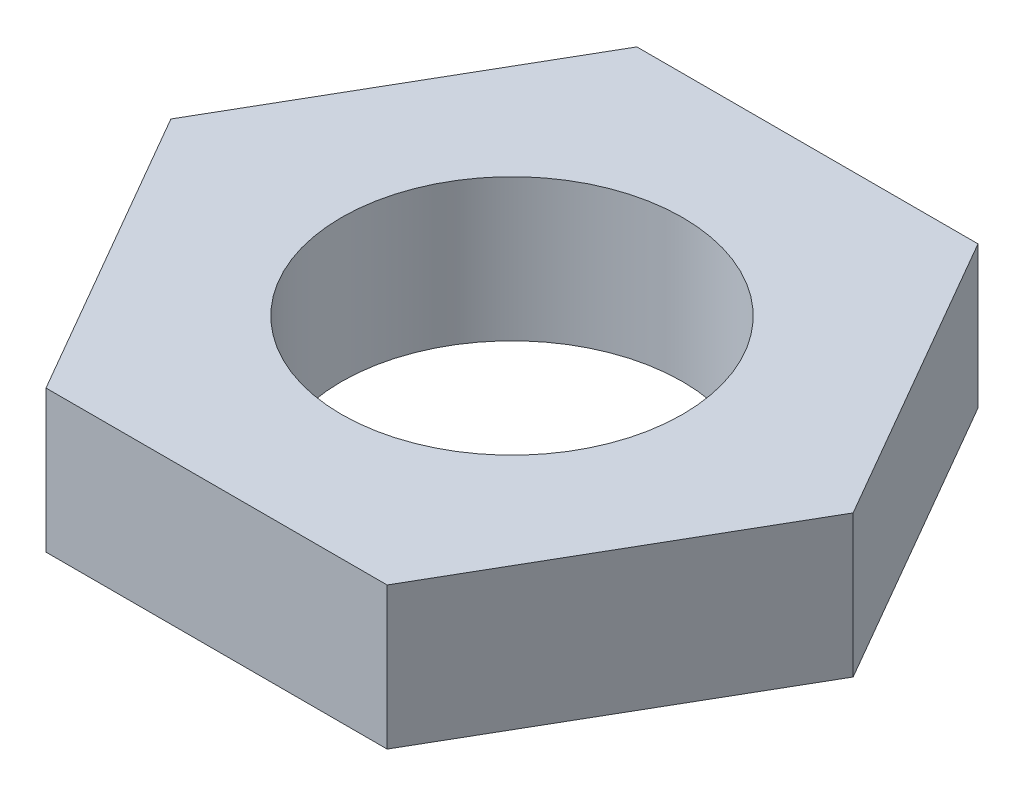
ISO-10303-21;
HEADER;
FILE_DESCRIPTION(('STEP AP214'),'2;1');
FILE_NAME('part.step','',(''),(''),'','','');
FILE_SCHEMA(('AUTOMOTIVE_DESIGN { 1 0 10303 214 1 1 1 1 }'));
ENDSEC;
DATA;
#1=APPLICATION_CONTEXT('core data for automotive mechanical design processes');
#2=APPLICATION_PROTOCOL_DEFINITION('international standard','automotive_design',2000,#1);
#3=PRODUCT_CONTEXT('',#1,'mechanical');
#4=PRODUCT('Part','Part','',(#3));
#5=PRODUCT_RELATED_PRODUCT_CATEGORY('part','',(#4));
#6=PRODUCT_DEFINITION_FORMATION('','',#4);
#7=PRODUCT_DEFINITION_CONTEXT('part definition',#1,'design');
#8=PRODUCT_DEFINITION('design','',#6,#7);
#9=PRODUCT_DEFINITION_SHAPE('','',#8);
#10=(LENGTH_UNIT() NAMED_UNIT(*) SI_UNIT(.MILLI.,.METRE.));
#11=(NAMED_UNIT(*) PLANE_ANGLE_UNIT() SI_UNIT($,.RADIAN.));
#12=(NAMED_UNIT(*) SI_UNIT($,.STERADIAN.) SOLID_ANGLE_UNIT());
#13=UNCERTAINTY_MEASURE_WITH_UNIT(LENGTH_MEASURE(1.E-05),#10,'distance_accuracy_value','');
#14=(GEOMETRIC_REPRESENTATION_CONTEXT(3) GLOBAL_UNCERTAINTY_ASSIGNED_CONTEXT((#13)) GLOBAL_UNIT_ASSIGNED_CONTEXT((#10,
#11,#12)) REPRESENTATION_CONTEXT('',''));
#15=CARTESIAN_POINT('',(0.,0.,0.));
#16=DIRECTION('',(0.,0.,1.));
#17=DIRECTION('',(1.,0.,0.));
#18=AXIS2_PLACEMENT_3D('',#15,#16,#17);
#19=CARTESIAN_POINT('',(0.,10.,0.));
#20=DIRECTION('',(0.,1.,0.));
#21=DIRECTION('',(0.,0.,1.));
#22=AXIS2_PLACEMENT_3D('',#19,#20,#21);
#23=PLANE('',#22);
#24=DIRECTION('',(1.,0.,0.));
#25=VECTOR('',#24,1.);
#26=CARTESIAN_POINT('',(-11.9999999999999,10.,20.784609690826));
#27=LINE('',#26,#25);
#28=CARTESIAN_POINT('',(-11.9999999999999,10.,20.784609690826));
#29=VERTEX_POINT('',#28);
#30=CARTESIAN_POINT('',(11.9999999999996,10.,20.7846096908262));
#31=VERTEX_POINT('',#30);
#32=EDGE_CURVE('E152',#29,#31,#27,.T.);
#33=ORIENTED_EDGE('',*,*,#32,.T.);
#34=DIRECTION('',(0.500000000000008,0.,-0.866025403784434));
#35=VECTOR('',#34,1.);
#36=CARTESIAN_POINT('',(11.9999999999996,10.,20.7846096908262));
#37=LINE('',#36,#35);
#38=CARTESIAN_POINT('',(23.9999999999995,10.,2.0643209364124E-13));
#39=VERTEX_POINT('',#38);
#40=EDGE_CURVE('E100',#31,#39,#37,.T.);
#41=ORIENTED_EDGE('',*,*,#40,.T.);
#42=DIRECTION('',(-0.499999999999993,0.,-0.866025403784443));
#43=VECTOR('',#42,1.);
#44=CARTESIAN_POINT('',(23.9999999999995,10.,2.0643209364124E-13));
#45=LINE('',#44,#43);
#46=CARTESIAN_POINT('',(11.9999999999999,10.,-20.784609690826));
#47=VERTEX_POINT('',#46);
#48=EDGE_CURVE('E113',#39,#47,#45,.T.);
#49=ORIENTED_EDGE('',*,*,#48,.T.);
#50=DIRECTION('',(-1.,0.,0.));
#51=VECTOR('',#50,1.);
#52=CARTESIAN_POINT('',(11.9999999999999,10.,-20.784609690826));
#53=LINE('',#52,#51);
#54=CARTESIAN_POINT('',(-11.9999999999996,10.,-20.7846096908262));
#55=VERTEX_POINT('',#54);
#56=EDGE_CURVE('E107',#47,#55,#53,.T.);
#57=ORIENTED_EDGE('',*,*,#56,.T.);
#58=DIRECTION('',(-0.500000000000007,0.,0.866025403784434));
#59=VECTOR('',#58,1.);
#60=CARTESIAN_POINT('',(-11.9999999999996,10.,-20.7846096908262));
#61=LINE('',#60,#59);
#62=CARTESIAN_POINT('',(-23.9999999999995,10.,-2.15105711021124E-13));
#63=VERTEX_POINT('',#62);
#64=EDGE_CURVE('E111',#55,#63,#61,.T.);
#65=ORIENTED_EDGE('',*,*,#64,.T.);
#66=DIRECTION('',(0.499999999999992,0.,0.866025403784443));
#67=VECTOR('',#66,1.);
#68=CARTESIAN_POINT('',(-23.9999999999995,10.,-2.15105711021124E-13));
#69=LINE('',#68,#67);
#70=EDGE_CURVE('E63',#63,#29,#69,.T.);
#71=ORIENTED_EDGE('',*,*,#70,.T.);
#72=EDGE_LOOP('',(#33,#41,#49,#57,#65,#71));
#73=FACE_BOUND('',#72,.T.);
#74=CARTESIAN_POINT('',(0.,10.,0.));
#75=DIRECTION('',(0.,1.,0.));
#76=DIRECTION('',(0.,0.,1.));
#77=AXIS2_PLACEMENT_3D('',#74,#75,#76);
#78=CIRCLE('',#77,12.);
#79=CARTESIAN_POINT('',(0.,10.,12.));
#80=VERTEX_POINT('',#79);
#81=EDGE_CURVE('E140',#80,#80,#78,.T.);
#82=ORIENTED_EDGE('',*,*,#81,.F.);
#83=EDGE_LOOP('',(#82));
#84=FACE_BOUND('',#83,.T.);
#85=ADVANCED_FACE('F45',(#73,#84),#23,.T.);
#86=CARTESIAN_POINT('',(0.,0.,0.));
#87=DIRECTION('',(0.,1.,0.));
#88=DIRECTION('',(0.,0.,1.));
#89=AXIS2_PLACEMENT_3D('',#86,#87,#88);
#90=PLANE('',#89);
#91=DIRECTION('',(1.,0.,0.));
#92=VECTOR('',#91,1.);
#93=CARTESIAN_POINT('',(-11.9999999999999,0.,20.784609690826));
#94=LINE('',#93,#92);
#95=CARTESIAN_POINT('',(-11.9999999999999,0.,20.784609690826));
#96=VERTEX_POINT('',#95);
#97=CARTESIAN_POINT('',(11.9999999999996,0.,20.7846096908262));
#98=VERTEX_POINT('',#97);
#99=EDGE_CURVE('E135',#96,#98,#94,.T.);
#100=ORIENTED_EDGE('',*,*,#99,.F.);
#101=DIRECTION('',(0.499999999999992,0.,0.866025403784443));
#102=VECTOR('',#101,1.);
#103=CARTESIAN_POINT('',(-23.9999999999995,0.,-2.15105711021124E-13));
#104=LINE('',#103,#102);
#105=CARTESIAN_POINT('',(-23.9999999999995,0.,-2.15105711021124E-13));
#106=VERTEX_POINT('',#105);
#107=EDGE_CURVE('E92',#106,#96,#104,.T.);
#108=ORIENTED_EDGE('',*,*,#107,.F.);
#109=DIRECTION('',(-0.500000000000007,0.,0.866025403784434));
#110=VECTOR('',#109,1.);
#111=CARTESIAN_POINT('',(-11.9999999999996,0.,-20.7846096908262));
#112=LINE('',#111,#110);
#113=CARTESIAN_POINT('',(-11.9999999999996,0.,-20.7846096908262));
#114=VERTEX_POINT('',#113);
#115=EDGE_CURVE('E86',#114,#106,#112,.T.);
#116=ORIENTED_EDGE('',*,*,#115,.F.);
#117=DIRECTION('',(-1.,0.,0.));
#118=VECTOR('',#117,1.);
#119=CARTESIAN_POINT('',(11.9999999999999,0.,-20.784609690826));
#120=LINE('',#119,#118);
#121=CARTESIAN_POINT('',(11.9999999999999,0.,-20.784609690826));
#122=VERTEX_POINT('',#121);
#123=EDGE_CURVE('E122',#122,#114,#120,.T.);
#124=ORIENTED_EDGE('',*,*,#123,.F.);
#125=DIRECTION('',(-0.499999999999993,0.,-0.866025403784443));
#126=VECTOR('',#125,1.);
#127=CARTESIAN_POINT('',(23.9999999999995,0.,2.0643209364124E-13));
#128=LINE('',#127,#126);
#129=CARTESIAN_POINT('',(23.9999999999995,0.,2.0643209364124E-13));
#130=VERTEX_POINT('',#129);
#131=EDGE_CURVE('E143',#130,#122,#128,.T.);
#132=ORIENTED_EDGE('',*,*,#131,.F.);
#133=DIRECTION('',(0.500000000000008,0.,-0.866025403784434));
#134=VECTOR('',#133,1.);
#135=CARTESIAN_POINT('',(11.9999999999996,0.,20.7846096908262));
#136=LINE('',#135,#134);
#137=EDGE_CURVE('E139',#98,#130,#136,.T.);
#138=ORIENTED_EDGE('',*,*,#137,.F.);
#139=EDGE_LOOP('',(#100,#108,#116,#124,#132,#138));
#140=FACE_BOUND('',#139,.T.);
#141=CARTESIAN_POINT('',(0.,0.,0.));
#142=DIRECTION('',(0.,1.,0.));
#143=DIRECTION('',(0.,0.,1.));
#144=AXIS2_PLACEMENT_3D('',#141,#142,#143);
#145=CIRCLE('',#144,12.);
#146=CARTESIAN_POINT('',(0.,0.,12.));
#147=VERTEX_POINT('',#146);
#148=EDGE_CURVE('E249',#147,#147,#145,.T.);
#149=ORIENTED_EDGE('',*,*,#148,.T.);
#150=EDGE_LOOP('',(#149));
#151=FACE_BOUND('',#150,.T.);
#152=ADVANCED_FACE('F165',(#140,#151),#90,.F.);
#153=CARTESIAN_POINT('',(-11.9999999999999,10.,20.784609690826));
#154=DIRECTION('',(0.,0.,-1.));
#155=DIRECTION('',(-1.,0.,0.));
#156=AXIS2_PLACEMENT_3D('',#153,#154,#155);
#157=PLANE('',#156);
#158=ORIENTED_EDGE('',*,*,#99,.T.);
#159=DIRECTION('',(0.,-1.,0.));
#160=VECTOR('',#159,1.);
#161=CARTESIAN_POINT('',(11.9999999999996,10.,20.7846096908262));
#162=LINE('',#161,#160);
#163=EDGE_CURVE('E11',#31,#98,#162,.T.);
#164=ORIENTED_EDGE('',*,*,#163,.F.);
#165=ORIENTED_EDGE('',*,*,#32,.F.);
#166=DIRECTION('',(0.,-1.,0.));
#167=VECTOR('',#166,1.);
#168=CARTESIAN_POINT('',(-11.9999999999999,10.,20.784609690826));
#169=LINE('',#168,#167);
#170=EDGE_CURVE('E131',#29,#96,#169,.T.);
#171=ORIENTED_EDGE('',*,*,#170,.T.);
#172=EDGE_LOOP('',(#158,#164,#165,#171));
#173=FACE_BOUND('',#172,.T.);
#174=ADVANCED_FACE('F47',(#173),#157,.F.);
#175=CARTESIAN_POINT('',(11.9999999999996,10.,20.7846096908262));
#176=DIRECTION('',(-0.866025403784434,0.,-0.500000000000008));
#177=DIRECTION('',(-0.500000000000008,0.,0.866025403784434));
#178=AXIS2_PLACEMENT_3D('',#175,#176,#177);
#179=PLANE('',#178);
#180=ORIENTED_EDGE('',*,*,#137,.T.);
#181=DIRECTION('',(0.,-1.,0.));
#182=VECTOR('',#181,1.);
#183=CARTESIAN_POINT('',(23.9999999999995,10.,2.0643209364124E-13));
#184=LINE('',#183,#182);
#185=EDGE_CURVE('E55',#39,#130,#184,.T.);
#186=ORIENTED_EDGE('',*,*,#185,.F.);
#187=ORIENTED_EDGE('',*,*,#40,.F.);
#188=ORIENTED_EDGE('',*,*,#163,.T.);
#189=EDGE_LOOP('',(#180,#186,#187,#188));
#190=FACE_BOUND('',#189,.T.);
#191=ADVANCED_FACE('F190',(#190),#179,.F.);
#192=CARTESIAN_POINT('',(23.9999999999995,10.,2.0643209364124E-13));
#193=DIRECTION('',(-0.866025403784443,0.,0.499999999999993));
#194=DIRECTION('',(0.499999999999993,0.,0.866025403784443));
#195=AXIS2_PLACEMENT_3D('',#192,#193,#194);
#196=PLANE('',#195);
#197=ORIENTED_EDGE('',*,*,#131,.T.);
#198=DIRECTION('',(0.,-1.,0.));
#199=VECTOR('',#198,1.);
#200=CARTESIAN_POINT('',(11.9999999999999,10.,-20.784609690826));
#201=LINE('',#200,#199);
#202=EDGE_CURVE('E124',#47,#122,#201,.T.);
#203=ORIENTED_EDGE('',*,*,#202,.F.);
#204=ORIENTED_EDGE('',*,*,#48,.F.);
#205=ORIENTED_EDGE('',*,*,#185,.T.);
#206=EDGE_LOOP('',(#197,#203,#204,#205));
#207=FACE_BOUND('',#206,.T.);
#208=ADVANCED_FACE('F162',(#207),#196,.F.);
#209=CARTESIAN_POINT('',(11.9999999999999,10.,-20.784609690826));
#210=DIRECTION('',(0.,0.,1.));
#211=DIRECTION('',(1.,0.,0.));
#212=AXIS2_PLACEMENT_3D('',#209,#210,#211);
#213=PLANE('',#212);
#214=ORIENTED_EDGE('',*,*,#123,.T.);
#215=DIRECTION('',(0.,-1.,0.));
#216=VECTOR('',#215,1.);
#217=CARTESIAN_POINT('',(-11.9999999999996,10.,-20.7846096908262));
#218=LINE('',#217,#216);
#219=EDGE_CURVE('E119',#55,#114,#218,.T.);
#220=ORIENTED_EDGE('',*,*,#219,.F.);
#221=ORIENTED_EDGE('',*,*,#56,.F.);
#222=ORIENTED_EDGE('',*,*,#202,.T.);
#223=EDGE_LOOP('',(#214,#220,#221,#222));
#224=FACE_BOUND('',#223,.T.);
#225=ADVANCED_FACE('F120',(#224),#213,.F.);
#226=CARTESIAN_POINT('',(-11.9999999999996,10.,-20.7846096908262));
#227=DIRECTION('',(0.866025403784434,0.,0.500000000000008));
#228=DIRECTION('',(0.500000000000008,0.,-0.866025403784434));
#229=AXIS2_PLACEMENT_3D('',#226,#227,#228);
#230=PLANE('',#229);
#231=ORIENTED_EDGE('',*,*,#115,.T.);
#232=DIRECTION('',(0.,-1.,0.));
#233=VECTOR('',#232,1.);
#234=CARTESIAN_POINT('',(-23.9999999999995,10.,-2.15105711021124E-13));
#235=LINE('',#234,#233);
#236=EDGE_CURVE('E125',#63,#106,#235,.T.);
#237=ORIENTED_EDGE('',*,*,#236,.F.);
#238=ORIENTED_EDGE('',*,*,#64,.F.);
#239=ORIENTED_EDGE('',*,*,#219,.T.);
#240=EDGE_LOOP('',(#231,#237,#238,#239));
#241=FACE_BOUND('',#240,.T.);
#242=ADVANCED_FACE('F127',(#241),#230,.F.);
#243=CARTESIAN_POINT('',(-23.9999999999995,10.,-2.15105711021124E-13));
#244=DIRECTION('',(0.866025403784443,0.,-0.499999999999993));
#245=DIRECTION('',(-0.499999999999993,0.,-0.866025403784443));
#246=AXIS2_PLACEMENT_3D('',#243,#244,#245);
#247=PLANE('',#246);
#248=ORIENTED_EDGE('',*,*,#107,.T.);
#249=ORIENTED_EDGE('',*,*,#170,.F.);
#250=ORIENTED_EDGE('',*,*,#70,.F.);
#251=ORIENTED_EDGE('',*,*,#236,.T.);
#252=EDGE_LOOP('',(#248,#249,#250,#251));
#253=FACE_BOUND('',#252,.T.);
#254=ADVANCED_FACE('F170',(#253),#247,.F.);
#255=CARTESIAN_POINT('',(0.,10.,0.));
#256=DIRECTION('',(0.,-1.,0.));
#257=DIRECTION('',(0.,0.,-1.));
#258=AXIS2_PLACEMENT_3D('',#255,#256,#257);
#259=CYLINDRICAL_SURFACE('',#258,12.);
#260=ORIENTED_EDGE('',*,*,#81,.T.);
#261=EDGE_LOOP('',(#260));
#262=FACE_BOUND('',#261,.T.);
#263=ORIENTED_EDGE('',*,*,#148,.F.);
#264=EDGE_LOOP('',(#263));
#265=FACE_BOUND('',#264,.T.);
#266=ADVANCED_FACE('F172',(#262,#265),#259,.F.);
#267=CLOSED_SHELL('',(#85,#152,#174,#191,#208,#225,#242,#254,#266));
#268=MANIFOLD_SOLID_BREP('B2',#267);
#269=ADVANCED_BREP_SHAPE_REPRESENTATION('',(#18,#268),#14);
#270=SHAPE_DEFINITION_REPRESENTATION(#9,#269);
ENDSEC;
END-ISO-10303-21;
